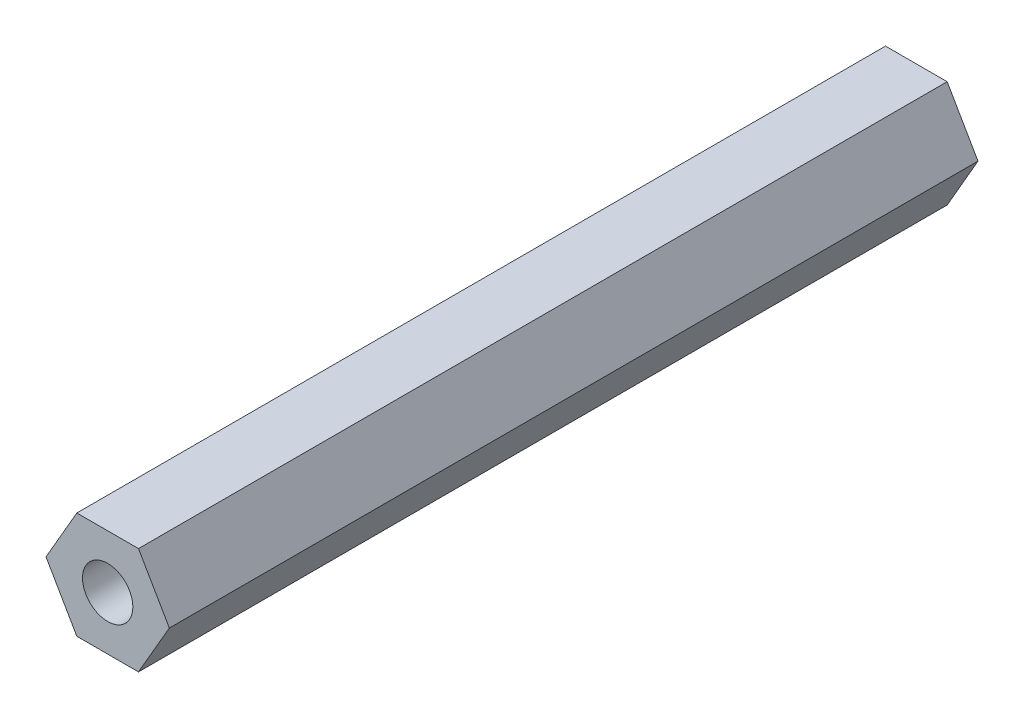
ISO-10303-21;
HEADER;
FILE_DESCRIPTION(('STEP AP214'),'2;1');
FILE_NAME('part.step','',(''),(''),'','','');
FILE_SCHEMA(('AUTOMOTIVE_DESIGN { 1 0 10303 214 1 1 1 1 }'));
ENDSEC;
DATA;
#1=APPLICATION_CONTEXT('core data for automotive mechanical design processes');
#2=APPLICATION_PROTOCOL_DEFINITION('international standard','automotive_design',2000,#1);
#3=PRODUCT_CONTEXT('',#1,'mechanical');
#4=PRODUCT('Part','Part','',(#3));
#5=PRODUCT_RELATED_PRODUCT_CATEGORY('part','',(#4));
#6=PRODUCT_DEFINITION_FORMATION('','',#4);
#7=PRODUCT_DEFINITION_CONTEXT('part definition',#1,'design');
#8=PRODUCT_DEFINITION('design','',#6,#7);
#9=PRODUCT_DEFINITION_SHAPE('','',#8);
#10=(LENGTH_UNIT() NAMED_UNIT(*) SI_UNIT(.MILLI.,.METRE.));
#11=(NAMED_UNIT(*) PLANE_ANGLE_UNIT() SI_UNIT($,.RADIAN.));
#12=(NAMED_UNIT(*) SI_UNIT($,.STERADIAN.) SOLID_ANGLE_UNIT());
#13=UNCERTAINTY_MEASURE_WITH_UNIT(LENGTH_MEASURE(1.E-05),#10,'distance_accuracy_value','');
#14=(GEOMETRIC_REPRESENTATION_CONTEXT(3) GLOBAL_UNCERTAINTY_ASSIGNED_CONTEXT((#13)) GLOBAL_UNIT_ASSIGNED_CONTEXT((#10,
#11,#12)) REPRESENTATION_CONTEXT('',''));
#15=CARTESIAN_POINT('',(0.,0.,0.));
#16=DIRECTION('',(0.,0.,1.));
#17=DIRECTION('',(1.,0.,0.));
#18=AXIS2_PLACEMENT_3D('',#15,#16,#17);
#19=CARTESIAN_POINT('',(4.04145188432738,0.,53.));
#20=DIRECTION('',(-0.866025403784438,-0.5,0.));
#21=DIRECTION('',(0.5,-0.866025403784438,0.));
#22=AXIS2_PLACEMENT_3D('',#19,#20,#21);
#23=PLANE('',#22);
#24=DIRECTION('',(0.,0.,-1.));
#25=VECTOR('',#24,1.);
#26=CARTESIAN_POINT('',(2.02072594216369,3.5,53.));
#27=LINE('',#26,#25);
#28=CARTESIAN_POINT('',(2.02072594216369,3.5,0.));
#29=VERTEX_POINT('',#28);
#30=CARTESIAN_POINT('',(2.02072594216369,3.5,53.));
#31=VERTEX_POINT('',#30);
#32=EDGE_CURVE('E84',#29,#31,#27,.F.);
#33=ORIENTED_EDGE('',*,*,#32,.T.);
#34=DIRECTION('',(-0.5,0.866025403784438,0.));
#35=VECTOR('',#34,1.);
#36=CARTESIAN_POINT('',(4.04145188432738,0.,53.));
#37=LINE('',#36,#35);
#38=CARTESIAN_POINT('',(4.04145188432738,0.,53.));
#39=VERTEX_POINT('',#38);
#40=EDGE_CURVE('E80',#39,#31,#37,.T.);
#41=ORIENTED_EDGE('',*,*,#40,.F.);
#42=DIRECTION('',(0.,0.,1.));
#43=VECTOR('',#42,1.);
#44=CARTESIAN_POINT('',(4.04145188432738,0.,53.));
#45=LINE('',#44,#43);
#46=CARTESIAN_POINT('',(4.04145188432738,0.,0.));
#47=VERTEX_POINT('',#46);
#48=EDGE_CURVE('E68',#39,#47,#45,.F.);
#49=ORIENTED_EDGE('',*,*,#48,.T.);
#50=DIRECTION('',(-0.5,0.866025403784438,0.));
#51=VECTOR('',#50,1.);
#52=CARTESIAN_POINT('',(4.04145188432738,0.,0.));
#53=LINE('',#52,#51);
#54=EDGE_CURVE('E117',#47,#29,#53,.T.);
#55=ORIENTED_EDGE('',*,*,#54,.T.);
#56=EDGE_LOOP('',(#33,#41,#49,#55));
#57=FACE_BOUND('',#56,.T.);
#58=ADVANCED_FACE('F17',(#57),#23,.F.);
#59=CARTESIAN_POINT('',(2.02072594216369,3.5,53.));
#60=DIRECTION('',(0.,-1.,0.));
#61=DIRECTION('',(0.,0.,-1.));
#62=AXIS2_PLACEMENT_3D('',#59,#60,#61);
#63=PLANE('',#62);
#64=DIRECTION('',(0.,0.,1.));
#65=VECTOR('',#64,1.);
#66=CARTESIAN_POINT('',(-2.02072594216369,3.5,53.));
#67=LINE('',#66,#65);
#68=CARTESIAN_POINT('',(-2.02072594216369,3.5,0.));
#69=VERTEX_POINT('',#68);
#70=CARTESIAN_POINT('',(-2.02072594216369,3.5,53.));
#71=VERTEX_POINT('',#70);
#72=EDGE_CURVE('E99',#69,#71,#67,.T.);
#73=ORIENTED_EDGE('',*,*,#72,.T.);
#74=DIRECTION('',(1.,0.,0.));
#75=VECTOR('',#74,1.);
#76=CARTESIAN_POINT('',(0.,3.5,53.));
#77=LINE('',#76,#75);
#78=EDGE_CURVE('E86',#31,#71,#77,.F.);
#79=ORIENTED_EDGE('',*,*,#78,.F.);
#80=ORIENTED_EDGE('',*,*,#32,.F.);
#81=DIRECTION('',(1.,0.,0.));
#82=VECTOR('',#81,1.);
#83=CARTESIAN_POINT('',(0.,3.5,0.));
#84=LINE('',#83,#82);
#85=EDGE_CURVE('E107',#29,#69,#84,.F.);
#86=ORIENTED_EDGE('',*,*,#85,.T.);
#87=EDGE_LOOP('',(#73,#79,#80,#86));
#88=FACE_BOUND('',#87,.T.);
#89=ADVANCED_FACE('F105',(#88),#63,.F.);
#90=CARTESIAN_POINT('',(-2.02072594216369,3.5,53.));
#91=DIRECTION('',(0.866025403784439,-0.499999999999999,0.));
#92=DIRECTION('',(0.499999999999999,0.866025403784439,0.));
#93=AXIS2_PLACEMENT_3D('',#90,#91,#92);
#94=PLANE('',#93);
#95=DIRECTION('',(0.,0.,1.));
#96=VECTOR('',#95,1.);
#97=CARTESIAN_POINT('',(-4.04145188432738,0.,53.));
#98=LINE('',#97,#96);
#99=CARTESIAN_POINT('',(-4.04145188432738,0.,0.));
#100=VERTEX_POINT('',#99);
#101=CARTESIAN_POINT('',(-4.04145188432738,0.,53.));
#102=VERTEX_POINT('',#101);
#103=EDGE_CURVE('E96',#100,#102,#98,.T.);
#104=ORIENTED_EDGE('',*,*,#103,.T.);
#105=DIRECTION('',(-0.499999999999999,-0.866025403784439,0.));
#106=VECTOR('',#105,1.);
#107=CARTESIAN_POINT('',(-2.02072594216369,3.5,53.));
#108=LINE('',#107,#106);
#109=EDGE_CURVE('E88',#71,#102,#108,.T.);
#110=ORIENTED_EDGE('',*,*,#109,.F.);
#111=ORIENTED_EDGE('',*,*,#72,.F.);
#112=DIRECTION('',(-0.499999999999999,-0.866025403784439,0.));
#113=VECTOR('',#112,1.);
#114=CARTESIAN_POINT('',(-2.02072594216369,3.5,0.));
#115=LINE('',#114,#113);
#116=EDGE_CURVE('E120',#69,#100,#115,.T.);
#117=ORIENTED_EDGE('',*,*,#116,.T.);
#118=EDGE_LOOP('',(#104,#110,#111,#117));
#119=FACE_BOUND('',#118,.T.);
#120=ADVANCED_FACE('F111',(#119),#94,.F.);
#121=CARTESIAN_POINT('',(-4.04145188432738,0.,53.));
#122=DIRECTION('',(0.866025403784438,0.5,0.));
#123=DIRECTION('',(-0.5,0.866025403784438,0.));
#124=AXIS2_PLACEMENT_3D('',#121,#122,#123);
#125=PLANE('',#124);
#126=DIRECTION('',(0.,0.,1.));
#127=VECTOR('',#126,1.);
#128=CARTESIAN_POINT('',(-2.02072594216369,-3.5,53.));
#129=LINE('',#128,#127);
#130=CARTESIAN_POINT('',(-2.02072594216369,-3.5,0.));
#131=VERTEX_POINT('',#130);
#132=CARTESIAN_POINT('',(-2.02072594216369,-3.5,53.));
#133=VERTEX_POINT('',#132);
#134=EDGE_CURVE('E93',#131,#133,#129,.T.);
#135=ORIENTED_EDGE('',*,*,#134,.T.);
#136=DIRECTION('',(0.5,-0.866025403784438,0.));
#137=VECTOR('',#136,1.);
#138=CARTESIAN_POINT('',(-4.04145188432738,0.,53.));
#139=LINE('',#138,#137);
#140=EDGE_CURVE('E113',#102,#133,#139,.T.);
#141=ORIENTED_EDGE('',*,*,#140,.F.);
#142=ORIENTED_EDGE('',*,*,#103,.F.);
#143=DIRECTION('',(0.5,-0.866025403784438,0.));
#144=VECTOR('',#143,1.);
#145=CARTESIAN_POINT('',(-4.04145188432738,0.,0.));
#146=LINE('',#145,#144);
#147=EDGE_CURVE('E122',#100,#131,#146,.T.);
#148=ORIENTED_EDGE('',*,*,#147,.T.);
#149=EDGE_LOOP('',(#135,#141,#142,#148));
#150=FACE_BOUND('',#149,.T.);
#151=ADVANCED_FACE('F152',(#150),#125,.F.);
#152=CARTESIAN_POINT('',(-2.02072594216369,-3.5,53.));
#153=DIRECTION('',(0.,1.,0.));
#154=DIRECTION('',(-1.,0.,0.));
#155=AXIS2_PLACEMENT_3D('',#152,#153,#154);
#156=PLANE('',#155);
#157=DIRECTION('',(0.,0.,1.));
#158=VECTOR('',#157,1.);
#159=CARTESIAN_POINT('',(2.02072594216369,-3.5,53.));
#160=LINE('',#159,#158);
#161=CARTESIAN_POINT('',(2.02072594216369,-3.5,0.));
#162=VERTEX_POINT('',#161);
#163=CARTESIAN_POINT('',(2.02072594216369,-3.5,53.));
#164=VERTEX_POINT('',#163);
#165=EDGE_CURVE('E33',#162,#164,#160,.T.);
#166=ORIENTED_EDGE('',*,*,#165,.T.);
#167=DIRECTION('',(1.,0.,0.));
#168=VECTOR('',#167,1.);
#169=CARTESIAN_POINT('',(0.,-3.5,53.));
#170=LINE('',#169,#168);
#171=EDGE_CURVE('E82',#133,#164,#170,.T.);
#172=ORIENTED_EDGE('',*,*,#171,.F.);
#173=ORIENTED_EDGE('',*,*,#134,.F.);
#174=DIRECTION('',(1.,0.,0.));
#175=VECTOR('',#174,1.);
#176=CARTESIAN_POINT('',(0.,-3.5,0.));
#177=LINE('',#176,#175);
#178=EDGE_CURVE('E125',#131,#162,#177,.T.);
#179=ORIENTED_EDGE('',*,*,#178,.T.);
#180=EDGE_LOOP('',(#166,#172,#173,#179));
#181=FACE_BOUND('',#180,.T.);
#182=ADVANCED_FACE('F149',(#181),#156,.F.);
#183=CARTESIAN_POINT('',(2.02072594216369,-3.5,53.));
#184=DIRECTION('',(-0.866025403784439,0.499999999999999,0.));
#185=DIRECTION('',(-0.499999999999999,-0.866025403784439,0.));
#186=AXIS2_PLACEMENT_3D('',#183,#184,#185);
#187=PLANE('',#186);
#188=ORIENTED_EDGE('',*,*,#48,.F.);
#189=DIRECTION('',(0.5,0.866025403784439,0.));
#190=VECTOR('',#189,1.);
#191=CARTESIAN_POINT('',(2.02072594216369,-3.5,53.));
#192=LINE('',#191,#190);
#193=EDGE_CURVE('E71',#164,#39,#192,.T.);
#194=ORIENTED_EDGE('',*,*,#193,.F.);
#195=ORIENTED_EDGE('',*,*,#165,.F.);
#196=DIRECTION('',(0.5,0.866025403784439,0.));
#197=VECTOR('',#196,1.);
#198=CARTESIAN_POINT('',(2.02072594216369,-3.5,0.));
#199=LINE('',#198,#197);
#200=EDGE_CURVE('E72',#162,#47,#199,.T.);
#201=ORIENTED_EDGE('',*,*,#200,.T.);
#202=EDGE_LOOP('',(#188,#194,#195,#201));
#203=FACE_BOUND('',#202,.T.);
#204=ADVANCED_FACE('F70',(#203),#187,.F.);
#205=CARTESIAN_POINT('',(0.,0.,53.));
#206=DIRECTION('',(0.,0.,1.));
#207=DIRECTION('',(1.,0.,0.));
#208=AXIS2_PLACEMENT_3D('',#205,#206,#207);
#209=PLANE('',#208);
#210=ORIENTED_EDGE('',*,*,#140,.T.);
#211=ORIENTED_EDGE('',*,*,#171,.T.);
#212=ORIENTED_EDGE('',*,*,#193,.T.);
#213=ORIENTED_EDGE('',*,*,#40,.T.);
#214=ORIENTED_EDGE('',*,*,#78,.T.);
#215=ORIENTED_EDGE('',*,*,#109,.T.);
#216=EDGE_LOOP('',(#210,#211,#212,#213,#214,#215));
#217=FACE_BOUND('',#216,.T.);
#218=CARTESIAN_POINT('',(0.,0.,53.));
#219=DIRECTION('',(0.,0.,1.));
#220=DIRECTION('',(1.,0.,0.));
#221=AXIS2_PLACEMENT_3D('',#218,#219,#220);
#222=CIRCLE('',#221,1.64999999999999);
#223=CARTESIAN_POINT('',(1.64999999999999,0.,53.));
#224=VERTEX_POINT('',#223);
#225=EDGE_CURVE('E20',#224,#224,#222,.F.);
#226=ORIENTED_EDGE('',*,*,#225,.T.);
#227=EDGE_LOOP('',(#226));
#228=FACE_BOUND('',#227,.T.);
#229=ADVANCED_FACE('F78',(#217,#228),#209,.T.);
#230=CARTESIAN_POINT('',(0.,0.,0.));
#231=DIRECTION('',(0.,0.,1.));
#232=DIRECTION('',(1.,0.,0.));
#233=AXIS2_PLACEMENT_3D('',#230,#231,#232);
#234=PLANE('',#233);
#235=ORIENTED_EDGE('',*,*,#178,.F.);
#236=ORIENTED_EDGE('',*,*,#147,.F.);
#237=ORIENTED_EDGE('',*,*,#116,.F.);
#238=ORIENTED_EDGE('',*,*,#85,.F.);
#239=ORIENTED_EDGE('',*,*,#54,.F.);
#240=ORIENTED_EDGE('',*,*,#200,.F.);
#241=EDGE_LOOP('',(#235,#236,#237,#238,#239,#240));
#242=FACE_BOUND('',#241,.T.);
#243=CARTESIAN_POINT('',(0.,0.,0.));
#244=DIRECTION('',(0.,0.,1.));
#245=DIRECTION('',(1.,0.,0.));
#246=AXIS2_PLACEMENT_3D('',#243,#244,#245);
#247=CIRCLE('',#246,1.64999999999999);
#248=CARTESIAN_POINT('',(1.64999999999999,0.,0.));
#249=VERTEX_POINT('',#248);
#250=EDGE_CURVE('E11',#249,#249,#247,.T.);
#251=ORIENTED_EDGE('',*,*,#250,.T.);
#252=EDGE_LOOP('',(#251));
#253=FACE_BOUND('',#252,.T.);
#254=ADVANCED_FACE('F133',(#242,#253),#234,.F.);
#255=CARTESIAN_POINT('',(0.,0.,53.));
#256=DIRECTION('',(0.,0.,1.));
#257=DIRECTION('',(1.,0.,0.));
#258=AXIS2_PLACEMENT_3D('',#255,#256,#257);
#259=CYLINDRICAL_SURFACE('',#258,1.64999999999999);
#260=ORIENTED_EDGE('',*,*,#225,.F.);
#261=EDGE_LOOP('',(#260));
#262=FACE_BOUND('',#261,.T.);
#263=ORIENTED_EDGE('',*,*,#250,.F.);
#264=EDGE_LOOP('',(#263));
#265=FACE_BOUND('',#264,.T.);
#266=ADVANCED_FACE('F130',(#262,#265),#259,.F.);
#267=CLOSED_SHELL('',(#58,#89,#120,#151,#182,#204,#229,#254,#266));
#268=MANIFOLD_SOLID_BREP('B1',#267);
#269=ADVANCED_BREP_SHAPE_REPRESENTATION('',(#18,#268),#14);
#270=SHAPE_DEFINITION_REPRESENTATION(#9,#269);
ENDSEC;
END-ISO-10303-21;
